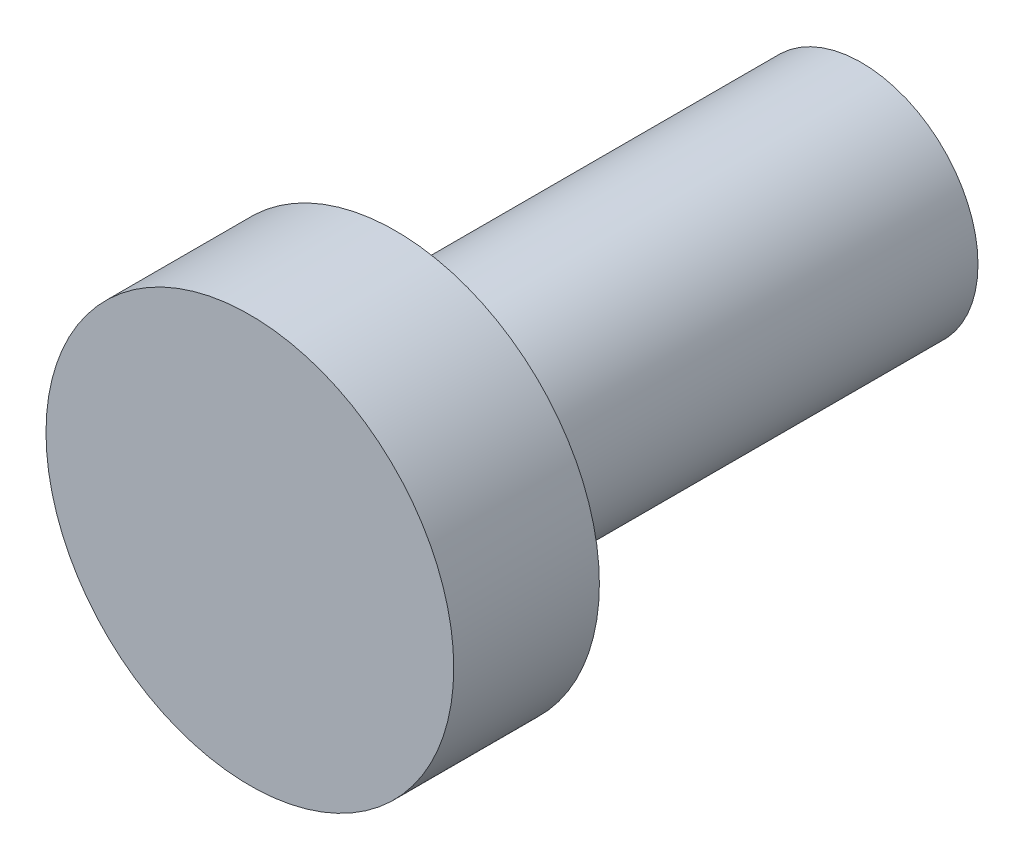
ISO-10303-21;
HEADER;
FILE_DESCRIPTION(('STEP AP214'),'2;1');
FILE_NAME('part.step','',(''),(''),'','','');
FILE_SCHEMA(('AUTOMOTIVE_DESIGN { 1 0 10303 214 1 1 1 1 }'));
ENDSEC;
DATA;
#1=APPLICATION_CONTEXT('core data for automotive mechanical design processes');
#2=APPLICATION_PROTOCOL_DEFINITION('international standard','automotive_design',2000,#1);
#3=PRODUCT_CONTEXT('',#1,'mechanical');
#4=PRODUCT('Part','Part','',(#3));
#5=PRODUCT_RELATED_PRODUCT_CATEGORY('part','',(#4));
#6=PRODUCT_DEFINITION_FORMATION('','',#4);
#7=PRODUCT_DEFINITION_CONTEXT('part definition',#1,'design');
#8=PRODUCT_DEFINITION('design','',#6,#7);
#9=PRODUCT_DEFINITION_SHAPE('','',#8);
#10=(LENGTH_UNIT() NAMED_UNIT(*) SI_UNIT(.MILLI.,.METRE.));
#11=(NAMED_UNIT(*) PLANE_ANGLE_UNIT() SI_UNIT($,.RADIAN.));
#12=(NAMED_UNIT(*) SI_UNIT($,.STERADIAN.) SOLID_ANGLE_UNIT());
#13=UNCERTAINTY_MEASURE_WITH_UNIT(LENGTH_MEASURE(1.E-05),#10,'distance_accuracy_value','');
#14=(GEOMETRIC_REPRESENTATION_CONTEXT(3) GLOBAL_UNCERTAINTY_ASSIGNED_CONTEXT((#13)) GLOBAL_UNIT_ASSIGNED_CONTEXT((#10,
#11,#12)) REPRESENTATION_CONTEXT('',''));
#15=CARTESIAN_POINT('',(0.,0.,0.));
#16=DIRECTION('',(0.,0.,1.));
#17=DIRECTION('',(1.,0.,0.));
#18=AXIS2_PLACEMENT_3D('',#15,#16,#17);
#19=CARTESIAN_POINT('',(0.,0.,-8.));
#20=DIRECTION('',(0.,0.,1.));
#21=DIRECTION('',(1.,0.,0.));
#22=AXIS2_PLACEMENT_3D('',#19,#20,#21);
#23=CYLINDRICAL_SURFACE('',#22,2.);
#24=CARTESIAN_POINT('',(0.,0.,-8.));
#25=DIRECTION('',(0.,0.,1.));
#26=DIRECTION('',(1.,0.,0.));
#27=AXIS2_PLACEMENT_3D('',#24,#25,#26);
#28=CIRCLE('',#27,2.);
#29=CARTESIAN_POINT('',(2.,0.,-8.));
#30=VERTEX_POINT('',#29);
#31=EDGE_CURVE('E10',#30,#30,#28,.T.);
#32=ORIENTED_EDGE('',*,*,#31,.T.);
#33=EDGE_LOOP('',(#32));
#34=FACE_BOUND('',#33,.T.);
#35=CARTESIAN_POINT('',(0.,0.,0.));
#36=DIRECTION('',(0.,0.,1.));
#37=DIRECTION('',(1.,0.,0.));
#38=AXIS2_PLACEMENT_3D('',#35,#36,#37);
#39=CIRCLE('',#38,2.);
#40=CARTESIAN_POINT('',(2.,0.,0.));
#41=VERTEX_POINT('',#40);
#42=EDGE_CURVE('E37',#41,#41,#39,.T.);
#43=ORIENTED_EDGE('',*,*,#42,.F.);
#44=EDGE_LOOP('',(#43));
#45=FACE_BOUND('',#44,.T.);
#46=ADVANCED_FACE('F40',(#34,#45),#23,.T.);
#47=CARTESIAN_POINT('',(0.,0.,-8.));
#48=DIRECTION('',(0.,0.,1.));
#49=DIRECTION('',(1.,0.,0.));
#50=AXIS2_PLACEMENT_3D('',#47,#48,#49);
#51=PLANE('',#50);
#52=ORIENTED_EDGE('',*,*,#31,.F.);
#53=EDGE_LOOP('',(#52));
#54=FACE_BOUND('',#53,.T.);
#55=ADVANCED_FACE('F58',(#54),#51,.F.);
#56=CARTESIAN_POINT('',(0.,0.,2.5));
#57=DIRECTION('',(0.,0.,-1.));
#58=DIRECTION('',(-1.,0.,0.));
#59=AXIS2_PLACEMENT_3D('',#56,#57,#58);
#60=CYLINDRICAL_SURFACE('',#59,3.5);
#61=CARTESIAN_POINT('',(0.,0.,2.5));
#62=DIRECTION('',(0.,0.,1.));
#63=DIRECTION('',(1.,0.,0.));
#64=AXIS2_PLACEMENT_3D('',#61,#62,#63);
#65=CIRCLE('',#64,3.5);
#66=CARTESIAN_POINT('',(3.5,0.,2.5));
#67=VERTEX_POINT('',#66);
#68=EDGE_CURVE('E50',#67,#67,#65,.T.);
#69=ORIENTED_EDGE('',*,*,#68,.F.);
#70=EDGE_LOOP('',(#69));
#71=FACE_BOUND('',#70,.T.);
#72=CARTESIAN_POINT('',(0.,0.,0.));
#73=DIRECTION('',(0.,0.,1.));
#74=DIRECTION('',(1.,0.,0.));
#75=AXIS2_PLACEMENT_3D('',#72,#73,#74);
#76=CIRCLE('',#75,3.5);
#77=CARTESIAN_POINT('',(3.5,0.,0.));
#78=VERTEX_POINT('',#77);
#79=EDGE_CURVE('E47',#78,#78,#76,.T.);
#80=ORIENTED_EDGE('',*,*,#79,.T.);
#81=EDGE_LOOP('',(#80));
#82=FACE_BOUND('',#81,.T.);
#83=ADVANCED_FACE('F60',(#71,#82),#60,.T.);
#84=CARTESIAN_POINT('',(0.,0.,2.5));
#85=DIRECTION('',(0.,0.,1.));
#86=DIRECTION('',(1.,0.,0.));
#87=AXIS2_PLACEMENT_3D('',#84,#85,#86);
#88=PLANE('',#87);
#89=ORIENTED_EDGE('',*,*,#68,.T.);
#90=EDGE_LOOP('',(#89));
#91=FACE_BOUND('',#90,.T.);
#92=ADVANCED_FACE('F54',(#91),#88,.T.);
#93=CARTESIAN_POINT('',(0.,0.,0.));
#94=DIRECTION('',(0.,0.,1.));
#95=DIRECTION('',(1.,0.,0.));
#96=AXIS2_PLACEMENT_3D('',#93,#94,#95);
#97=PLANE('',#96);
#98=ORIENTED_EDGE('',*,*,#42,.T.);
#99=EDGE_LOOP('',(#98));
#100=FACE_BOUND('',#99,.T.);
#101=ORIENTED_EDGE('',*,*,#79,.F.);
#102=EDGE_LOOP('',(#101));
#103=FACE_BOUND('',#102,.T.);
#104=ADVANCED_FACE('F63',(#100,#103),#97,.F.);
#105=CLOSED_SHELL('',(#46,#55,#83,#92,#104));
#106=MANIFOLD_SOLID_BREP('B2',#105);
#107=ADVANCED_BREP_SHAPE_REPRESENTATION('',(#18,#106),#14);
#108=SHAPE_DEFINITION_REPRESENTATION(#9,#107);
ENDSEC;
END-ISO-10303-21;
